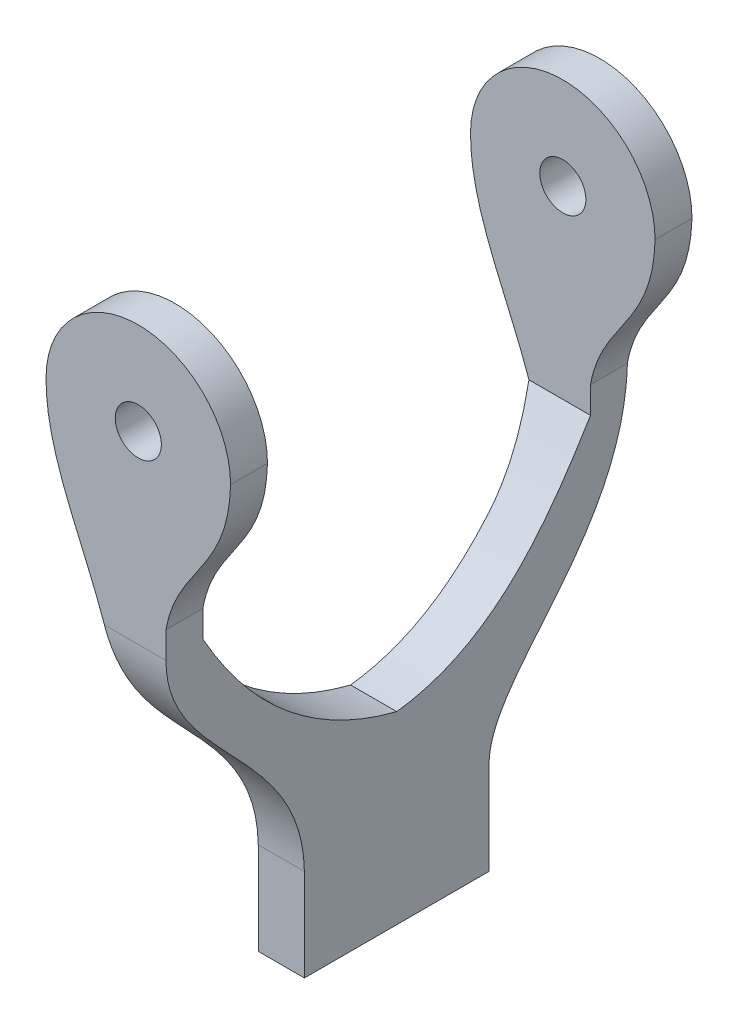
ISO-10303-21;
HEADER;
FILE_DESCRIPTION(('STEP AP214'),'2;1');
FILE_NAME('part.step','',(''),(''),'','','');
FILE_SCHEMA(('AUTOMOTIVE_DESIGN { 1 0 10303 214 1 1 1 1 }'));
ENDSEC;
DATA;
#1=APPLICATION_CONTEXT('core data for automotive mechanical design processes');
#2=APPLICATION_PROTOCOL_DEFINITION('international standard','automotive_design',2000,#1);
#3=PRODUCT_CONTEXT('',#1,'mechanical');
#4=PRODUCT('Part','Part','',(#3));
#5=PRODUCT_RELATED_PRODUCT_CATEGORY('part','',(#4));
#6=PRODUCT_DEFINITION_FORMATION('','',#4);
#7=PRODUCT_DEFINITION_CONTEXT('part definition',#1,'design');
#8=PRODUCT_DEFINITION('design','',#6,#7);
#9=PRODUCT_DEFINITION_SHAPE('','',#8);
#10=(LENGTH_UNIT() NAMED_UNIT(*) SI_UNIT(.MILLI.,.METRE.));
#11=(NAMED_UNIT(*) PLANE_ANGLE_UNIT() SI_UNIT($,.RADIAN.));
#12=(NAMED_UNIT(*) SI_UNIT($,.STERADIAN.) SOLID_ANGLE_UNIT());
#13=UNCERTAINTY_MEASURE_WITH_UNIT(LENGTH_MEASURE(1.E-05),#10,'distance_accuracy_value','');
#14=(GEOMETRIC_REPRESENTATION_CONTEXT(3) GLOBAL_UNCERTAINTY_ASSIGNED_CONTEXT((#13)) GLOBAL_UNIT_ASSIGNED_CONTEXT((#10,
#11,#12)) REPRESENTATION_CONTEXT('',''));
#15=CARTESIAN_POINT('',(0.,0.,0.));
#16=DIRECTION('',(0.,0.,1.));
#17=DIRECTION('',(1.,0.,0.));
#18=AXIS2_PLACEMENT_3D('',#15,#16,#17);
#19=CARTESIAN_POINT('',(3.,0.,50.));
#20=DIRECTION('',(1.,0.,0.));
#21=DIRECTION('',(0.,0.,-1.));
#22=AXIS2_PLACEMENT_3D('',#19,#20,#21);
#23=PLANE('',#22);
#24=CARTESIAN_POINT('',(3.,-47.3,35.));
#25=CARTESIAN_POINT('',(3.,-34.6195089742628,35.2327439155144));
#26=CARTESIAN_POINT('',(3.,-30.3831516594517,49.9872871394027));
#27=CARTESIAN_POINT('',(3.,-20.,50.));
#28=B_SPLINE_CURVE_WITH_KNOTS('',3,(#24,#25,#26,#27),.UNSPECIFIED.,.F.,.F.,(4,4),(0.,1.),.UNSPECIFIED.);
#29=CARTESIAN_POINT('',(3.,-47.3,35.));
#30=VERTEX_POINT('',#29);
#31=CARTESIAN_POINT('',(3.,-20.,50.));
#32=VERTEX_POINT('',#31);
#33=EDGE_CURVE('E225',#30,#32,#28,.T.);
#34=ORIENTED_EDGE('',*,*,#33,.F.);
#35=DIRECTION('',(0.,1.,0.));
#36=VECTOR('',#35,1.);
#37=CARTESIAN_POINT('',(3.,0.,35.));
#38=LINE('',#37,#36);
#39=CARTESIAN_POINT('',(3.,-57.3,35.));
#40=VERTEX_POINT('',#39);
#41=EDGE_CURVE('E467',#40,#30,#38,.T.);
#42=ORIENTED_EDGE('',*,*,#41,.F.);
#43=DIRECTION('',(0.,0.,-1.));
#44=VECTOR('',#43,1.);
#45=CARTESIAN_POINT('',(3.,-57.3,50.));
#46=LINE('',#45,#44);
#47=CARTESIAN_POINT('',(3.,-57.3,15.));
#48=VERTEX_POINT('',#47);
#49=EDGE_CURVE('E747',#40,#48,#46,.T.);
#50=ORIENTED_EDGE('',*,*,#49,.T.);
#51=DIRECTION('',(0.,1.,0.));
#52=VECTOR('',#51,1.);
#53=CARTESIAN_POINT('',(3.,0.,15.));
#54=LINE('',#53,#52);
#55=CARTESIAN_POINT('',(3.,-47.3,15.));
#56=VERTEX_POINT('',#55);
#57=EDGE_CURVE('E330',#48,#56,#54,.T.);
#58=ORIENTED_EDGE('',*,*,#57,.T.);
#59=CARTESIAN_POINT('',(3.,-47.3,15.));
#60=CARTESIAN_POINT('',(3.,-39.1518738556845,14.9787719706216));
#61=CARTESIAN_POINT('',(3.,-32.7020693906786,0.432832626758433));
#62=CARTESIAN_POINT('',(3.,-17.1256964213214,0.));
#63=B_SPLINE_CURVE_WITH_KNOTS('',3,(#59,#60,#61,#62),.UNSPECIFIED.,.F.,.F.,(4,4),(0.,1.),.UNSPECIFIED.);
#64=CARTESIAN_POINT('',(3.,-17.1256964213214,0.));
#65=VERTEX_POINT('',#64);
#66=EDGE_CURVE('E338',#56,#65,#63,.T.);
#67=ORIENTED_EDGE('',*,*,#66,.T.);
#68=DIRECTION('',(0.,0.,-1.));
#69=VECTOR('',#68,1.);
#70=CARTESIAN_POINT('',(3.,-17.1256964213214,50.));
#71=LINE('',#70,#69);
#72=CARTESIAN_POINT('',(3.,-17.1256964213214,4.00000000000002));
#73=VERTEX_POINT('',#72);
#74=EDGE_CURVE('E528',#73,#65,#71,.T.);
#75=ORIENTED_EDGE('',*,*,#74,.F.);
#76=DIRECTION('',(0.,1.,0.));
#77=VECTOR('',#76,1.);
#78=CARTESIAN_POINT('',(3.,0.,4.00000000000002));
#79=LINE('',#78,#77);
#80=CARTESIAN_POINT('',(3.,-20.,4.00000000000002));
#81=VERTEX_POINT('',#80);
#82=EDGE_CURVE('E438',#81,#73,#79,.T.);
#83=ORIENTED_EDGE('',*,*,#82,.F.);
#84=CARTESIAN_POINT('',(3.,-20.,4.00000000000002));
#85=CARTESIAN_POINT('',(3.,-27.7513887530113,8.70854721162843));
#86=CARTESIAN_POINT('',(3.,-36.0463975967775,14.5376235676267));
#87=CARTESIAN_POINT('',(3.,-37.3,25.));
#88=B_SPLINE_CURVE_WITH_KNOTS('',3,(#84,#85,#86,#87),.UNSPECIFIED.,.F.,.F.,(4,4),(0.,1.),.UNSPECIFIED.);
#89=CARTESIAN_POINT('',(3.,-37.3,25.));
#90=VERTEX_POINT('',#89);
#91=EDGE_CURVE('E488',#81,#90,#88,.T.);
#92=ORIENTED_EDGE('',*,*,#91,.T.);
#93=CARTESIAN_POINT('',(3.,-20.,46.));
#94=CARTESIAN_POINT('',(3.,-29.3151360524413,40.7756498759149));
#95=CARTESIAN_POINT('',(3.,-35.0937326612851,33.7969783945719));
#96=CARTESIAN_POINT('',(3.,-37.3,25.));
#97=B_SPLINE_CURVE_WITH_KNOTS('',3,(#93,#94,#95,#96),.UNSPECIFIED.,.F.,.F.,(4,4),(0.,1.),.UNSPECIFIED.);
#98=CARTESIAN_POINT('',(3.,-20.,46.));
#99=VERTEX_POINT('',#98);
#100=EDGE_CURVE('E475',#99,#90,#97,.T.);
#101=ORIENTED_EDGE('',*,*,#100,.F.);
#102=DIRECTION('',(0.,1.,0.));
#103=VECTOR('',#102,1.);
#104=CARTESIAN_POINT('',(3.,0.,46.));
#105=LINE('',#104,#103);
#106=CARTESIAN_POINT('',(3.,-17.1256964213214,46.));
#107=VERTEX_POINT('',#106);
#108=EDGE_CURVE('E331',#99,#107,#105,.T.);
#109=ORIENTED_EDGE('',*,*,#108,.T.);
#110=CARTESIAN_POINT('',(3.,-17.1256964213214,50.));
#111=VERTEX_POINT('',#110);
#112=EDGE_CURVE('E532',#111,#107,#71,.T.);
#113=ORIENTED_EDGE('',*,*,#112,.F.);
#114=DIRECTION('',(0.,-1.,0.));
#115=VECTOR('',#114,1.);
#116=CARTESIAN_POINT('',(3.,0.,50.));
#117=LINE('',#116,#115);
#118=EDGE_CURVE('E576',#111,#32,#117,.T.);
#119=ORIENTED_EDGE('',*,*,#118,.T.);
#120=EDGE_LOOP('',(#34,#42,#50,#58,#67,#75,#83,#92,#101,#109,#113,#119));
#121=FACE_BOUND('',#120,.T.);
#122=ADVANCED_FACE('F202',(#121),#23,.T.);
#123=CARTESIAN_POINT('',(10.,0.,50.));
#124=CARTESIAN_POINT('',(9.76053706222571,-8.68136411070866,50.));
#125=CARTESIAN_POINT('',(4.19700701561525,-10.3098091101832,50.));
#126=CARTESIAN_POINT('',(3.,-17.1256964213214,50.));
#127=B_SPLINE_CURVE_WITH_KNOTS('',3,(#123,#124,#125,#126),.UNSPECIFIED.,.F.,.F.,(4,4),(0.,1.),.UNSPECIFIED.);
#128=DIRECTION('',(0.,0.,-1.));
#129=VECTOR('',#128,1.);
#130=SURFACE_OF_LINEAR_EXTRUSION('',#127,#129);
#131=ORIENTED_EDGE('',*,*,#112,.T.);
#132=CARTESIAN_POINT('',(10.,0.,46.));
#133=CARTESIAN_POINT('',(9.76053706222571,-8.68136411070866,46.));
#134=CARTESIAN_POINT('',(4.19700701561525,-10.3098091101832,46.));
#135=CARTESIAN_POINT('',(3.,-17.1256964213214,46.));
#136=B_SPLINE_CURVE_WITH_KNOTS('',3,(#132,#133,#134,#135),.UNSPECIFIED.,.F.,.F.,(4,4),(0.,1.),.UNSPECIFIED.);
#137=CARTESIAN_POINT('',(10.,0.,46.));
#138=VERTEX_POINT('',#137);
#139=EDGE_CURVE('E454',#107,#138,#136,.F.);
#140=ORIENTED_EDGE('',*,*,#139,.T.);
#141=DIRECTION('',(0.,0.,-1.));
#142=VECTOR('',#141,1.);
#143=CARTESIAN_POINT('',(10.,0.,50.));
#144=LINE('',#143,#142);
#145=CARTESIAN_POINT('',(10.,0.,50.));
#146=VERTEX_POINT('',#145);
#147=EDGE_CURVE('E533',#146,#138,#144,.T.);
#148=ORIENTED_EDGE('',*,*,#147,.F.);
#149=EDGE_CURVE('E572',#146,#111,#127,.T.);
#150=ORIENTED_EDGE('',*,*,#149,.T.);
#151=EDGE_LOOP('',(#131,#140,#148,#150));
#152=FACE_BOUND('',#151,.T.);
#153=ADVANCED_FACE('F570',(#152),#130,.T.);
#154=CARTESIAN_POINT('',(0.,0.,50.));
#155=DIRECTION('',(0.,0.,-1.));
#156=DIRECTION('',(-1.,0.,0.));
#157=AXIS2_PLACEMENT_3D('',#154,#155,#156);
#158=CYLINDRICAL_SURFACE('',#157,10.);
#159=CARTESIAN_POINT('',(0.,0.,46.));
#160=DIRECTION('',(0.,0.,-1.));
#161=DIRECTION('',(-1.,0.,0.));
#162=AXIS2_PLACEMENT_3D('',#159,#160,#161);
#163=CIRCLE('',#162,10.);
#164=CARTESIAN_POINT('',(-10.,0.,46.));
#165=VERTEX_POINT('',#164);
#166=EDGE_CURVE('E449',#165,#138,#163,.T.);
#167=ORIENTED_EDGE('',*,*,#166,.F.);
#168=DIRECTION('',(0.,0.,-1.));
#169=VECTOR('',#168,1.);
#170=CARTESIAN_POINT('',(-10.,0.,50.));
#171=LINE('',#170,#169);
#172=CARTESIAN_POINT('',(-10.,0.,50.));
#173=VERTEX_POINT('',#172);
#174=EDGE_CURVE('E563',#173,#165,#171,.T.);
#175=ORIENTED_EDGE('',*,*,#174,.F.);
#176=CARTESIAN_POINT('',(0.,0.,50.));
#177=DIRECTION('',(0.,0.,1.));
#178=DIRECTION('',(1.,0.,0.));
#179=AXIS2_PLACEMENT_3D('',#176,#177,#178);
#180=CIRCLE('',#179,10.);
#181=EDGE_CURVE('E575',#146,#173,#180,.T.);
#182=ORIENTED_EDGE('',*,*,#181,.F.);
#183=ORIENTED_EDGE('',*,*,#147,.T.);
#184=EDGE_LOOP('',(#167,#175,#182,#183));
#185=FACE_BOUND('',#184,.T.);
#186=ADVANCED_FACE('F593',(#185),#158,.T.);
#187=CARTESIAN_POINT('',(-10.,0.,50.));
#188=CARTESIAN_POINT('',(-10.0381025429552,-9.9152488273029,50.));
#189=CARTESIAN_POINT('',(-2.13214803939277,-18.0107089346552,50.));
#190=CARTESIAN_POINT('',(-2.,-28.65,50.));
#191=B_SPLINE_CURVE_WITH_KNOTS('',3,(#187,#188,#189,#190),.UNSPECIFIED.,.F.,.F.,(4,4),(0.,1.),.UNSPECIFIED.);
#192=DIRECTION('',(0.,0.,-1.));
#193=VECTOR('',#192,1.);
#194=SURFACE_OF_LINEAR_EXTRUSION('',#191,#193);
#195=CARTESIAN_POINT('',(-2.,-28.65,3.24522796726486));
#196=CARTESIAN_POINT('',(-2.00319050221691,-28.3918035784122,3.10181861466091));
#197=CARTESIAN_POINT('',(-2.0110357024876,-28.1315540666096,2.96216444686479));
#198=CARTESIAN_POINT('',(-2.03622458556083,-27.6072590318931,2.69099481375502));
#199=CARTESIAN_POINT('',(-2.05356959796605,-27.3432129826509,2.55948049057015));
#200=CARTESIAN_POINT('',(-2.09794552033224,-26.8117181077601,2.30526445536006));
#201=CARTESIAN_POINT('',(-2.12497604473298,-26.5442694179724,2.18256239277031));
#202=CARTESIAN_POINT('',(-2.18876805357431,-26.0064284652427,1.94652555654433));
#203=CARTESIAN_POINT('',(-2.2255290304579,-25.7360363565397,1.8331902947243));
#204=CARTESIAN_POINT('',(-2.30763755000294,-25.1997660198973,1.61911727294138));
#205=CARTESIAN_POINT('',(-2.35274109471458,-24.9339495211835,1.51813123379908));
#206=CARTESIAN_POINT('',(-2.45190106280641,-24.4005438751176,1.32581601529002));
#207=CARTESIAN_POINT('',(-2.50595620988256,-24.1329549856837,1.23448546229778));
#208=CARTESIAN_POINT('',(-2.62268483906275,-23.5965290603403,1.06168893292526));
#209=CARTESIAN_POINT('',(-2.68535689434335,-23.327692238175,0.980221327588259));
#210=CARTESIAN_POINT('',(-2.81885903251058,-22.7893020249097,0.827252348026532));
#211=CARTESIAN_POINT('',(-2.88968682469996,-22.5197488556886,0.755748187784257));
#212=CARTESIAN_POINT('',(-3.04259631065746,-21.9671809993579,0.619433337165946));
#213=CARTESIAN_POINT('',(-3.12505789783672,-21.6841494756087,0.555117609107765));
#214=CARTESIAN_POINT('',(-3.29762694257031,-21.118172132811,0.437288751416228));
#215=CARTESIAN_POINT('',(-3.3877345630193,-20.8352263157174,0.38377585201346));
#216=CARTESIAN_POINT('',(-3.5747992317091,-20.269735141511,0.287332175405288));
#217=CARTESIAN_POINT('',(-3.67175777752292,-19.9871898858135,0.244403721163421));
#218=CARTESIAN_POINT('',(-3.87374435113785,-19.416890110047,0.168067840884002));
#219=CARTESIAN_POINT('',(-3.97889939213684,-19.1291513215938,0.134880175978607));
#220=CARTESIAN_POINT('',(-4.19444071270027,-18.5547136859973,0.0789217274812884));
#221=CARTESIAN_POINT('',(-4.30482575893047,-18.2680146106691,0.0561485013281013));
#222=CARTESIAN_POINT('',(-4.52977686426043,-17.6959203249283,0.0206490904042412));
#223=CARTESIAN_POINT('',(-4.6443392102313,-17.4105241986115,0.0079142000302709));
#224=CARTESIAN_POINT('',(-4.76055078593592,-17.1256964213214,0.));
#225=B_SPLINE_CURVE_WITH_KNOTS('',3,(#195,#196,#197,#198,#199,#200,#201,#202,#203,#204,#205,
#206,#207,#208,#209,#210,#211,#212,#213,#214,#215,#216,#217,#218,#219,#220,#221,#222,#223,#224),
.UNSPECIFIED.,.F.,.F.,(4,2,2,2,2,2,2,2,2,2,2,2,2,2,4),(0.,0.886066767381674,1.77225758120832,
2.65841312152641,3.54452244756588,4.40793974092059,5.27123403554818,6.13438555409037,
6.99729522838533,7.9021909800306,8.80710601483749,9.71221947452267,10.6364112796944,
11.5603862172707,12.4835589664749),.UNSPECIFIED.);
#226=CARTESIAN_POINT('',(-2.,-28.6499999902453,3.24522796184754));
#227=VERTEX_POINT('',#226);
#228=CARTESIAN_POINT('',(-4.7605507861737,-17.1256964207386,0.));
#229=VERTEX_POINT('',#228);
#230=EDGE_CURVE('E347',#227,#229,#225,.T.);
#231=ORIENTED_EDGE('',*,*,#230,.F.);
#232=DIRECTION('',(0.,0.,-1.));
#233=VECTOR('',#232,1.);
#234=CARTESIAN_POINT('',(-2.,-28.65,50.));
#235=LINE('',#234,#233);
#236=CARTESIAN_POINT('',(-2.,-28.6500000005184,10.0408694635859));
#237=VERTEX_POINT('',#236);
#238=EDGE_CURVE('E346',#237,#227,#235,.T.);
#239=ORIENTED_EDGE('',*,*,#238,.F.);
#240=CARTESIAN_POINT('',(-3.66836925329302,-20.,4.00000000000002));
#241=CARTESIAN_POINT('',(-3.58325952012987,-20.2457187671724,4.14926177942749));
#242=CARTESIAN_POINT('',(-3.50053248037769,-20.4917004050733,4.29947564828459));
#243=CARTESIAN_POINT('',(-3.34062207075634,-20.983216351856,4.60172206923875));
#244=CARTESIAN_POINT('',(-3.26342234161704,-21.2287496902266,4.7537475568553));
#245=CARTESIAN_POINT('',(-3.11501685187096,-21.7192409870309,5.0600272179929));
#246=CARTESIAN_POINT('',(-3.04379513144173,-21.9641986625015,5.21427407976655));
#247=CARTESIAN_POINT('',(-2.90773588417486,-22.4533866661485,5.52539777441254));
#248=CARTESIAN_POINT('',(-2.84288404390861,-22.6976173709655,5.68226773877573));
#249=CARTESIAN_POINT('',(-2.71990374133921,-23.1851873762409,5.99904081903819));
#250=CARTESIAN_POINT('',(-2.66176393530821,-23.4285274871522,6.15893826956205));
#251=CARTESIAN_POINT('',(-2.55249037159493,-23.9141335561717,6.48217290342177));
#252=CARTESIAN_POINT('',(-2.50134960634212,-24.156400350162,6.64550645455734));
#253=CARTESIAN_POINT('',(-2.40623749109161,-24.6399689209758,6.97624046717939));
#254=CARTESIAN_POINT('',(-2.36227411324641,-24.8812693382154,7.14364521680807));
#255=CARTESIAN_POINT('',(-2.28177323068728,-25.3622936409798,7.4826948736232));
#256=CARTESIAN_POINT('',(-2.24523907890267,-25.6020167676293,7.65434165628689));
#257=CARTESIAN_POINT('',(-2.17969878911859,-26.0795906808111,8.00227762483459));
#258=CARTESIAN_POINT('',(-2.15070233715697,-26.3174386811419,8.17857246643165));
#259=CARTESIAN_POINT('',(-2.10026636623018,-26.7909463085338,8.53622341760222));
#260=CARTESIAN_POINT('',(-2.07884368210517,-27.0265999408216,8.71758984729966));
#261=CARTESIAN_POINT('',(-2.0435192610474,-27.4953815031883,9.0858241552931));
#262=CARTESIAN_POINT('',(-2.02964201470679,-27.7284988302088,9.27270789663451));
#263=CARTESIAN_POINT('',(-2.00927285348669,-28.1918418614888,9.65243704940226));
#264=CARTESIAN_POINT('',(-2.00281309079348,-28.4220507308788,9.84530472092453));
#265=CARTESIAN_POINT('',(-2.,-28.65,10.0408694631412));
#266=B_SPLINE_CURVE_WITH_KNOTS('',3,(#240,#241,#242,#243,#244,#245,#246,#247,#248,#249,#250,
#251,#252,#253,#254,#255,#256,#257,#258,#259,#260,#261,#262,#263,#264,#265),.UNSPECIFIED.,.F.,
.F.,(4,2,2,2,2,2,2,2,2,2,2,2,4),(0.,0.899510558674917,1.79623819473745,2.69049013036843,
3.58268431998395,4.47334786427279,5.36311303174749,6.25385986301706,7.1450078147876,
8.0372953044067,8.9315538665807,9.82869789871525,10.729716226968),.UNSPECIFIED.);
#267=CARTESIAN_POINT('',(-3.66836925362566,-20.,4.00000000000002));
#268=VERTEX_POINT('',#267);
#269=EDGE_CURVE('E479',#268,#237,#266,.T.);
#270=ORIENTED_EDGE('',*,*,#269,.F.);
#271=CARTESIAN_POINT('',(-10.,0.,4.00000000000002));
#272=CARTESIAN_POINT('',(-10.0381025429552,-9.9152488273029,4.00000000000002));
#273=CARTESIAN_POINT('',(-2.13214803939277,-18.0107089346552,4.00000000000002));
#274=CARTESIAN_POINT('',(-2.,-28.65,4.00000000000002));
#275=B_SPLINE_CURVE_WITH_KNOTS('',3,(#271,#272,#273,#274),.UNSPECIFIED.,.F.,.F.,(4,4),(0.,1.),.UNSPECIFIED.);
#276=CARTESIAN_POINT('',(-10.,0.,4.00000000000002));
#277=VERTEX_POINT('',#276);
#278=EDGE_CURVE('E420',#268,#277,#275,.F.);
#279=ORIENTED_EDGE('',*,*,#278,.T.);
#280=CARTESIAN_POINT('',(-10.,0.,0.));
#281=VERTEX_POINT('',#280);
#282=EDGE_CURVE('E779',#277,#281,#171,.T.);
#283=ORIENTED_EDGE('',*,*,#282,.T.);
#284=CARTESIAN_POINT('',(-10.,0.,0.));
#285=CARTESIAN_POINT('',(-10.0381025429552,-9.9152488273029,0.));
#286=CARTESIAN_POINT('',(-2.13214803939277,-18.0107089346552,0.));
#287=CARTESIAN_POINT('',(-2.,-28.65,0.));
#288=B_SPLINE_CURVE_WITH_KNOTS('',3,(#284,#285,#286,#287),.UNSPECIFIED.,.F.,.F.,(4,4),(0.,1.),.UNSPECIFIED.);
#289=EDGE_CURVE('E766',#281,#229,#288,.T.);
#290=ORIENTED_EDGE('',*,*,#289,.T.);
#291=EDGE_LOOP('',(#231,#239,#270,#279,#283,#290));
#292=FACE_BOUND('',#291,.T.);
#293=ADVANCED_FACE('F598',(#292),#194,.F.);
#294=CARTESIAN_POINT('',(-2.,0.,50.));
#295=DIRECTION('',(1.,0.,0.));
#296=DIRECTION('',(0.,0.,-1.));
#297=AXIS2_PLACEMENT_3D('',#294,#295,#296);
#298=PLANE('',#297);
#299=DIRECTION('',(0.,1.,0.));
#300=VECTOR('',#299,1.);
#301=CARTESIAN_POINT('',(-2.,0.,35.));
#302=LINE('',#301,#300);
#303=CARTESIAN_POINT('',(-2.,-57.3,35.));
#304=VERTEX_POINT('',#303);
#305=CARTESIAN_POINT('',(-2.,-47.3,35.));
#306=VERTEX_POINT('',#305);
#307=EDGE_CURVE('E465',#304,#306,#302,.T.);
#308=ORIENTED_EDGE('',*,*,#307,.T.);
#309=CARTESIAN_POINT('',(-2.,-47.3,35.));
#310=CARTESIAN_POINT('',(-2.,-34.6195089742628,35.2327439155144));
#311=CARTESIAN_POINT('',(-2.,-30.3831516594517,49.9872871394027));
#312=CARTESIAN_POINT('',(-2.,-20.,50.));
#313=B_SPLINE_CURVE_WITH_KNOTS('',3,(#309,#310,#311,#312),.UNSPECIFIED.,.F.,.F.,(4,4),(0.,1.),.UNSPECIFIED.);
#314=CARTESIAN_POINT('',(-2.,-28.6500000000008,46.3427193832673));
#315=VERTEX_POINT('',#314);
#316=EDGE_CURVE('E413',#306,#315,#313,.T.);
#317=ORIENTED_EDGE('',*,*,#316,.T.);
#318=CARTESIAN_POINT('',(-2.,-28.6499999902558,39.7049280451041));
#319=VERTEX_POINT('',#318);
#320=EDGE_CURVE('E557',#315,#319,#235,.T.);
#321=ORIENTED_EDGE('',*,*,#320,.T.);
#322=CARTESIAN_POINT('',(-2.,-20.,46.));
#323=CARTESIAN_POINT('',(-2.,-29.3151360524413,40.7756498759149));
#324=CARTESIAN_POINT('',(-2.,-35.0937326612851,33.7969783945719));
#325=CARTESIAN_POINT('',(-2.,-37.3,25.));
#326=B_SPLINE_CURVE_WITH_KNOTS('',3,(#322,#323,#324,#325),.UNSPECIFIED.,.F.,.F.,(4,4),(0.,1.),.UNSPECIFIED.);
#327=CARTESIAN_POINT('',(-2.,-37.3,25.));
#328=VERTEX_POINT('',#327);
#329=EDGE_CURVE('E211',#319,#328,#326,.T.);
#330=ORIENTED_EDGE('',*,*,#329,.T.);
#331=CARTESIAN_POINT('',(-2.,-20.,4.00000000000002));
#332=CARTESIAN_POINT('',(-2.,-27.7513887530113,8.70854721162843));
#333=CARTESIAN_POINT('',(-2.,-36.0463975967775,14.5376235676267));
#334=CARTESIAN_POINT('',(-2.,-37.3,25.));
#335=B_SPLINE_CURVE_WITH_KNOTS('',3,(#331,#332,#333,#334),.UNSPECIFIED.,.F.,.F.,(4,4),(0.,1.),.UNSPECIFIED.);
#336=EDGE_CURVE('E12',#237,#328,#335,.T.);
#337=ORIENTED_EDGE('',*,*,#336,.F.);
#338=ORIENTED_EDGE('',*,*,#238,.T.);
#339=CARTESIAN_POINT('',(-2.,-47.3,15.));
#340=CARTESIAN_POINT('',(-2.,-39.1518738556845,14.9787719706216));
#341=CARTESIAN_POINT('',(-2.,-32.7020693906786,0.432832626758433));
#342=CARTESIAN_POINT('',(-2.,-17.1256964213214,0.));
#343=B_SPLINE_CURVE_WITH_KNOTS('',3,(#339,#340,#341,#342),.UNSPECIFIED.,.F.,.F.,(4,4),(0.,1.),.UNSPECIFIED.);
#344=CARTESIAN_POINT('',(-2.,-47.3,15.));
#345=VERTEX_POINT('',#344);
#346=EDGE_CURVE('E335',#345,#227,#343,.T.);
#347=ORIENTED_EDGE('',*,*,#346,.F.);
#348=DIRECTION('',(0.,1.,0.));
#349=VECTOR('',#348,1.);
#350=CARTESIAN_POINT('',(-2.,0.,15.));
#351=LINE('',#350,#349);
#352=CARTESIAN_POINT('',(-2.,-57.3,15.));
#353=VERTEX_POINT('',#352);
#354=EDGE_CURVE('E319',#353,#345,#351,.T.);
#355=ORIENTED_EDGE('',*,*,#354,.F.);
#356=DIRECTION('',(0.,0.,-1.));
#357=VECTOR('',#356,1.);
#358=CARTESIAN_POINT('',(-2.,-57.3,50.));
#359=LINE('',#358,#357);
#360=EDGE_CURVE('E777',#304,#353,#359,.T.);
#361=ORIENTED_EDGE('',*,*,#360,.F.);
#362=EDGE_LOOP('',(#308,#317,#321,#330,#337,#338,#347,#355,#361));
#363=FACE_BOUND('',#362,.T.);
#364=ADVANCED_FACE('F343',(#363),#298,.F.);
#365=CARTESIAN_POINT('',(0.,-57.3,50.));
#366=DIRECTION('',(0.,-1.,0.));
#367=DIRECTION('',(0.,0.,-1.));
#368=AXIS2_PLACEMENT_3D('',#365,#366,#367);
#369=PLANE('',#368);
#370=DIRECTION('',(1.,0.,0.));
#371=VECTOR('',#370,1.);
#372=CARTESIAN_POINT('',(-10.0190512714776,-57.3,35.));
#373=LINE('',#372,#371);
#374=EDGE_CURVE('E504',#304,#40,#373,.T.);
#375=ORIENTED_EDGE('',*,*,#374,.F.);
#376=ORIENTED_EDGE('',*,*,#360,.T.);
#377=DIRECTION('',(1.,0.,0.));
#378=VECTOR('',#377,1.);
#379=CARTESIAN_POINT('',(-10.0190512714776,-57.3,15.));
#380=LINE('',#379,#378);
#381=EDGE_CURVE('E325',#353,#48,#380,.T.);
#382=ORIENTED_EDGE('',*,*,#381,.T.);
#383=ORIENTED_EDGE('',*,*,#49,.F.);
#384=EDGE_LOOP('',(#375,#376,#382,#383));
#385=FACE_BOUND('',#384,.T.);
#386=ADVANCED_FACE('F623',(#385),#369,.T.);
#387=CARTESIAN_POINT('',(0.,0.,50.));
#388=DIRECTION('',(0.,0.,-1.));
#389=DIRECTION('',(-1.,0.,0.));
#390=AXIS2_PLACEMENT_3D('',#387,#388,#389);
#391=CYLINDRICAL_SURFACE('',#390,2.5);
#392=CARTESIAN_POINT('',(0.,0.,50.));
#393=DIRECTION('',(0.,0.,1.));
#394=DIRECTION('',(1.,0.,0.));
#395=AXIS2_PLACEMENT_3D('',#392,#393,#394);
#396=CIRCLE('',#395,2.5);
#397=CARTESIAN_POINT('',(2.5,0.,50.));
#398=VERTEX_POINT('',#397);
#399=EDGE_CURVE('E745',#398,#398,#396,.T.);
#400=ORIENTED_EDGE('',*,*,#399,.T.);
#401=EDGE_LOOP('',(#400));
#402=FACE_BOUND('',#401,.T.);
#403=CARTESIAN_POINT('',(0.,0.,46.));
#404=DIRECTION('',(0.,0.,-1.));
#405=DIRECTION('',(-1.,0.,0.));
#406=AXIS2_PLACEMENT_3D('',#403,#404,#405);
#407=CIRCLE('',#406,2.5);
#408=CARTESIAN_POINT('',(-2.5,0.,46.));
#409=VERTEX_POINT('',#408);
#410=EDGE_CURVE('E443',#409,#409,#407,.T.);
#411=ORIENTED_EDGE('',*,*,#410,.T.);
#412=EDGE_LOOP('',(#411));
#413=FACE_BOUND('',#412,.T.);
#414=ADVANCED_FACE('F629',(#402,#413),#391,.F.);
#415=CARTESIAN_POINT('',(0.,0.,0.));
#416=DIRECTION('',(0.,0.,1.));
#417=DIRECTION('',(1.,0.,0.));
#418=AXIS2_PLACEMENT_3D('',#415,#416,#417);
#419=PLANE('',#418);
#420=CARTESIAN_POINT('',(0.,0.,0.));
#421=DIRECTION('',(0.,0.,1.));
#422=DIRECTION('',(1.,0.,0.));
#423=AXIS2_PLACEMENT_3D('',#420,#421,#422);
#424=CIRCLE('',#423,2.5);
#425=CARTESIAN_POINT('',(2.5,0.,0.));
#426=VERTEX_POINT('',#425);
#427=EDGE_CURVE('E580',#426,#426,#424,.T.);
#428=ORIENTED_EDGE('',*,*,#427,.T.);
#429=EDGE_LOOP('',(#428));
#430=FACE_BOUND('',#429,.T.);
#431=DIRECTION('',(1.,0.,0.));
#432=VECTOR('',#431,1.);
#433=CARTESIAN_POINT('',(-10.0190512714776,-17.1256964213214,0.));
#434=LINE('',#433,#432);
#435=EDGE_CURVE('E536',#229,#65,#434,.T.);
#436=ORIENTED_EDGE('',*,*,#435,.F.);
#437=ORIENTED_EDGE('',*,*,#289,.F.);
#438=CARTESIAN_POINT('',(0.,0.,0.));
#439=DIRECTION('',(0.,0.,1.));
#440=DIRECTION('',(1.,0.,0.));
#441=AXIS2_PLACEMENT_3D('',#438,#439,#440);
#442=CIRCLE('',#441,10.);
#443=CARTESIAN_POINT('',(10.,0.,0.));
#444=VERTEX_POINT('',#443);
#445=EDGE_CURVE('E760',#444,#281,#442,.T.);
#446=ORIENTED_EDGE('',*,*,#445,.F.);
#447=CARTESIAN_POINT('',(10.,0.,0.));
#448=CARTESIAN_POINT('',(9.76053706222571,-8.68136411070866,0.));
#449=CARTESIAN_POINT('',(4.19700701561525,-10.3098091101832,0.));
#450=CARTESIAN_POINT('',(3.,-17.1256964213214,0.));
#451=B_SPLINE_CURVE_WITH_KNOTS('',3,(#447,#448,#449,#450),.UNSPECIFIED.,.F.,.F.,(4,4),(0.,1.),.UNSPECIFIED.);
#452=EDGE_CURVE('E756',#444,#65,#451,.T.);
#453=ORIENTED_EDGE('',*,*,#452,.T.);
#454=EDGE_LOOP('',(#436,#437,#446,#453));
#455=FACE_BOUND('',#454,.T.);
#456=ADVANCED_FACE('F590',(#430,#455),#419,.F.);
#457=CARTESIAN_POINT('',(10.,0.,4.00000000000002));
#458=CARTESIAN_POINT('',(9.76053706222571,-8.68136411070866,4.00000000000002));
#459=CARTESIAN_POINT('',(4.19700701561525,-10.3098091101832,4.00000000000002));
#460=CARTESIAN_POINT('',(3.,-17.1256964213214,4.00000000000002));
#461=B_SPLINE_CURVE_WITH_KNOTS('',3,(#457,#458,#459,#460),.UNSPECIFIED.,.F.,.F.,(4,4),(0.,1.),.UNSPECIFIED.);
#462=CARTESIAN_POINT('',(10.,0.,4.00000000000002));
#463=VERTEX_POINT('',#462);
#464=EDGE_CURVE('E433',#73,#463,#461,.F.);
#465=ORIENTED_EDGE('',*,*,#464,.F.);
#466=ORIENTED_EDGE('',*,*,#74,.T.);
#467=ORIENTED_EDGE('',*,*,#452,.F.);
#468=EDGE_CURVE('E538',#463,#444,#144,.T.);
#469=ORIENTED_EDGE('',*,*,#468,.F.);
#470=EDGE_LOOP('',(#465,#466,#467,#469));
#471=FACE_BOUND('',#470,.T.);
#472=ADVANCED_FACE('F587',(#471),#130,.T.);
#473=CARTESIAN_POINT('',(0.,0.,4.00000000000002));
#474=DIRECTION('',(0.,0.,-1.));
#475=DIRECTION('',(-1.,0.,0.));
#476=AXIS2_PLACEMENT_3D('',#473,#474,#475);
#477=CIRCLE('',#476,10.);
#478=EDGE_CURVE('E428',#277,#463,#477,.T.);
#479=ORIENTED_EDGE('',*,*,#478,.T.);
#480=ORIENTED_EDGE('',*,*,#468,.T.);
#481=ORIENTED_EDGE('',*,*,#445,.T.);
#482=ORIENTED_EDGE('',*,*,#282,.F.);
#483=EDGE_LOOP('',(#479,#480,#481,#482));
#484=FACE_BOUND('',#483,.T.);
#485=ADVANCED_FACE('F589',(#484),#158,.T.);
#486=ORIENTED_EDGE('',*,*,#320,.F.);
#487=CARTESIAN_POINT('',(-2.,-28.65,46.3427193832679));
#488=CARTESIAN_POINT('',(-2.00236533589441,-28.4600499674117,46.4981762076589));
#489=CARTESIAN_POINT('',(-2.00722930192484,-28.2682920525821,46.6514496940761));
#490=CARTESIAN_POINT('',(-2.02225306190209,-27.8802782694031,46.9528859511209));
#491=CARTESIAN_POINT('',(-2.03242543674649,-27.6840127791407,47.1010356851924));
#492=CARTESIAN_POINT('',(-2.0583660004298,-27.2868493975294,47.3908410384336));
#493=CARTESIAN_POINT('',(-2.07413848777538,-27.085948058887,47.5324915744033));
#494=CARTESIAN_POINT('',(-2.1117630227677,-26.6774515688899,47.8092026054318));
#495=CARTESIAN_POINT('',(-2.13367012139138,-26.469811604888,47.9441897605968));
#496=CARTESIAN_POINT('',(-2.18379682962612,-26.0495869946527,48.2046786847607));
#497=CARTESIAN_POINT('',(-2.21201201596011,-25.8370059063109,48.3301870182773));
#498=CARTESIAN_POINT('',(-2.27503432020262,-25.4068150649889,48.5703414037776));
#499=CARTESIAN_POINT('',(-2.30983907332753,-25.1892071405001,48.6849913304186));
#500=CARTESIAN_POINT('',(-2.38018102702405,-24.7840645018254,48.8848009910705));
#501=CARTESIAN_POINT('',(-2.41472446080045,-24.5972409061351,48.9717527266225));
#502=CARTESIAN_POINT('',(-2.48868925093109,-24.2203700560313,49.1361934735995));
#503=CARTESIAN_POINT('',(-2.52811139211257,-24.0303222872062,49.2136809585366));
#504=CARTESIAN_POINT('',(-2.61181684106467,-23.6474101526628,49.3584583284379));
#505=CARTESIAN_POINT('',(-2.6561004773363,-23.4545455973728,49.4257475235509));
#506=CARTESIAN_POINT('',(-2.74918015817752,-23.0675313132848,49.549209883805));
#507=CARTESIAN_POINT('',(-2.79795127291393,-22.8733936601966,49.6054395934334));
#508=CARTESIAN_POINT('',(-2.90000719452353,-22.483430959125,49.7068095544039));
#509=CARTESIAN_POINT('',(-2.95329171530028,-22.2876060188015,49.7519505079352));
#510=CARTESIAN_POINT('',(-3.06408011174939,-21.8949629529654,49.8309147903301));
#511=CARTESIAN_POINT('',(-3.12158205313322,-21.69814532084,49.8647432684852));
#512=CARTESIAN_POINT('',(-3.21874708436437,-21.3760848593588,49.9108035394383));
#513=CARTESIAN_POINT('',(-3.25725216047257,-21.2509636449927,49.9264102293289));
#514=CARTESIAN_POINT('',(-3.33571812858239,-21.0007283932284,49.9531079380633));
#515=CARTESIAN_POINT('',(-3.37567868908796,-20.875614360616,49.9641999782276));
#516=CARTESIAN_POINT('',(-3.49775209874331,-20.4999641789411,49.9908557407953));
#517=CARTESIAN_POINT('',(-3.58191181194685,-20.2495985437733,49.9997312801721));
#518=CARTESIAN_POINT('',(-3.66836925329303,-20.,50.));
#519=B_SPLINE_CURVE_WITH_KNOTS('',3,(#487,#488,#489,#490,#491,#492,#493,#494,#495,#496,#497,
#498,#499,#500,#501,#502,#503,#504,#505,#506,#507,#508,#509,#510,#511,#512,#513,#514,#515,#516,
#517,#518),.UNSPECIFIED.,.F.,.F.,(4,2,2,2,2,2,2,2,2,2,2,2,2,2,2,4),(0.,0.736428743241335,
1.47461079844455,2.21336069307779,2.95896503252075,3.70404817947887,4.44886444514598,
5.07541858937716,5.70207365737366,6.32877109580906,6.95217596515967,7.57554134756178,
8.19862259469028,8.59405999444652,8.98940788712472,9.78161394322275),.UNSPECIFIED.);
#520=CARTESIAN_POINT('',(-3.66836925362566,-20.,50.));
#521=VERTEX_POINT('',#520);
#522=EDGE_CURVE('E407',#315,#521,#519,.T.);
#523=ORIENTED_EDGE('',*,*,#522,.T.);
#524=EDGE_CURVE('E578',#173,#521,#191,.T.);
#525=ORIENTED_EDGE('',*,*,#524,.F.);
#526=ORIENTED_EDGE('',*,*,#174,.T.);
#527=CARTESIAN_POINT('',(-10.,0.,46.));
#528=CARTESIAN_POINT('',(-10.0381025429552,-9.9152488273029,46.));
#529=CARTESIAN_POINT('',(-2.13214803939277,-18.0107089346552,46.));
#530=CARTESIAN_POINT('',(-2.,-28.65,46.));
#531=B_SPLINE_CURVE_WITH_KNOTS('',3,(#527,#528,#529,#530),.UNSPECIFIED.,.F.,.F.,(4,4),(0.,1.),.UNSPECIFIED.);
#532=CARTESIAN_POINT('',(-3.66836925362566,-20.,46.));
#533=VERTEX_POINT('',#532);
#534=EDGE_CURVE('E444',#533,#165,#531,.F.);
#535=ORIENTED_EDGE('',*,*,#534,.F.);
#536=CARTESIAN_POINT('',(-3.66836925329302,-20.,46.));
#537=CARTESIAN_POINT('',(-3.58008541337576,-20.2548719142355,45.8570542339928));
#538=CARTESIAN_POINT('',(-3.49462074635185,-20.5093079247177,45.7115587074918));
#539=CARTESIAN_POINT('',(-3.33018516479001,-21.0159141561589,45.4159675624189));
#540=CARTESIAN_POINT('',(-3.25118621555047,-21.2680894162472,45.2658961536947));
#541=CARTESIAN_POINT('',(-3.10001449869995,-21.7701403693315,44.9609412537344));
#542=CARTESIAN_POINT('',(-3.02781617914123,-22.0200212019806,44.8060789389099));
#543=CARTESIAN_POINT('',(-2.89050293756991,-22.5174138426793,44.4913293093694));
#544=CARTESIAN_POINT('',(-2.82536659332723,-22.7649306126744,44.3314592025828));
#545=CARTESIAN_POINT('',(-2.70237736649061,-23.2575089581936,44.0064732098045));
#546=CARTESIAN_POINT('',(-2.64450868121198,-23.5025747555391,43.8413697185425));
#547=CARTESIAN_POINT('',(-2.53619345767321,-23.9901434594783,43.5056897907078));
#548=CARTESIAN_POINT('',(-2.48573806544768,-24.2326490969711,43.3351201841779));
#549=CARTESIAN_POINT('',(-2.3922901313243,-24.7151691759879,42.9881301867058));
#550=CARTESIAN_POINT('',(-2.34930294478921,-24.9551817147305,42.8117057043918));
#551=CARTESIAN_POINT('',(-2.27087073452925,-25.4323154696582,42.4529333757453));
#552=CARTESIAN_POINT('',(-2.23543210732334,-25.6694340744624,42.2705806555366));
#553=CARTESIAN_POINT('',(-2.17205898472072,-26.1405868493287,41.8997255557474));
#554=CARTESIAN_POINT('',(-2.14413913191225,-26.3746141687338,41.7112119668957));
#555=CARTESIAN_POINT('',(-2.09570373651826,-26.8393782344115,41.3277994176775));
#556=CARTESIAN_POINT('',(-2.07521118318058,-27.0701026761394,41.1328826344799));
#557=CARTESIAN_POINT('',(-2.04147821192373,-27.5280397758395,40.7364161669638));
#558=CARTESIAN_POINT('',(-2.02826885223519,-27.7552334395796,40.5348419030153));
#559=CARTESIAN_POINT('',(-2.00887426420232,-28.2058788308275,40.1248056616282));
#560=CARTESIAN_POINT('',(-2.00272738583922,-28.4293036970936,39.9163123457789));
#561=CARTESIAN_POINT('',(-2.,-28.65,39.7049280357713));
#562=B_SPLINE_CURVE_WITH_KNOTS('',3,(#536,#537,#538,#539,#540,#541,#542,#543,#544,#545,#546,
#547,#548,#549,#550,#551,#552,#553,#554,#555,#556,#557,#558,#559,#560,#561),.UNSPECIFIED.,.F.,
.F.,(4,2,2,2,2,2,2,2,2,2,2,2,4),(0.,0.915795278118216,1.82738241082724,2.73539505786665,
3.64057130522281,4.54374396006889,5.44582899813322,6.34855826446886,7.25204947131876,
8.15728768067431,9.0653043587706,9.97716378490973,10.893951639836),.UNSPECIFIED.);
#563=EDGE_CURVE('E469',#533,#319,#562,.T.);
#564=ORIENTED_EDGE('',*,*,#563,.T.);
#565=EDGE_LOOP('',(#486,#523,#525,#526,#535,#564));
#566=FACE_BOUND('',#565,.T.);
#567=ADVANCED_FACE('F369',(#566),#194,.F.);
#568=CARTESIAN_POINT('',(0.,0.,4.00000000000002));
#569=DIRECTION('',(0.,0.,-1.));
#570=DIRECTION('',(-1.,0.,0.));
#571=AXIS2_PLACEMENT_3D('',#568,#569,#570);
#572=CIRCLE('',#571,2.5);
#573=CARTESIAN_POINT('',(-2.5,0.,4.00000000000002));
#574=VERTEX_POINT('',#573);
#575=EDGE_CURVE('E419',#574,#574,#572,.T.);
#576=ORIENTED_EDGE('',*,*,#575,.F.);
#577=EDGE_LOOP('',(#576));
#578=FACE_BOUND('',#577,.T.);
#579=ORIENTED_EDGE('',*,*,#427,.F.);
#580=EDGE_LOOP('',(#579));
#581=FACE_BOUND('',#580,.T.);
#582=ADVANCED_FACE('F597',(#578,#581),#391,.F.);
#583=CARTESIAN_POINT('',(0.,0.,50.));
#584=DIRECTION('',(0.,0.,1.));
#585=DIRECTION('',(1.,0.,0.));
#586=AXIS2_PLACEMENT_3D('',#583,#584,#585);
#587=PLANE('',#586);
#588=DIRECTION('',(1.,0.,0.));
#589=VECTOR('',#588,1.);
#590=CARTESIAN_POINT('',(-10.0190512714776,-20.,50.));
#591=LINE('',#590,#589);
#592=EDGE_CURVE('E543',#32,#521,#591,.F.);
#593=ORIENTED_EDGE('',*,*,#592,.F.);
#594=ORIENTED_EDGE('',*,*,#118,.F.);
#595=ORIENTED_EDGE('',*,*,#149,.F.);
#596=ORIENTED_EDGE('',*,*,#181,.T.);
#597=ORIENTED_EDGE('',*,*,#524,.T.);
#598=EDGE_LOOP('',(#593,#594,#595,#596,#597));
#599=FACE_BOUND('',#598,.T.);
#600=ORIENTED_EDGE('',*,*,#399,.F.);
#601=EDGE_LOOP('',(#600));
#602=FACE_BOUND('',#601,.T.);
#603=ADVANCED_FACE('F499',(#599,#602),#587,.T.);
#604=CARTESIAN_POINT('',(-10.0190512714776,0.,15.));
#605=DIRECTION('',(0.,0.,-1.));
#606=DIRECTION('',(-1.,0.,0.));
#607=AXIS2_PLACEMENT_3D('',#604,#605,#606);
#608=PLANE('',#607);
#609=ORIENTED_EDGE('',*,*,#381,.F.);
#610=ORIENTED_EDGE('',*,*,#354,.T.);
#611=DIRECTION('',(1.,0.,0.));
#612=VECTOR('',#611,1.);
#613=CARTESIAN_POINT('',(-10.0190512714776,-47.3,15.));
#614=LINE('',#613,#612);
#615=EDGE_CURVE('E322',#345,#56,#614,.T.);
#616=ORIENTED_EDGE('',*,*,#615,.T.);
#617=ORIENTED_EDGE('',*,*,#57,.F.);
#618=EDGE_LOOP('',(#609,#610,#616,#617));
#619=FACE_BOUND('',#618,.T.);
#620=ADVANCED_FACE('F321',(#619),#608,.T.);
#621=CARTESIAN_POINT('',(-10.0190512714776,-47.3,15.));
#622=CARTESIAN_POINT('',(-10.0190512714776,-39.1518738556845,14.9787719706216));
#623=CARTESIAN_POINT('',(-10.0190512714776,-32.7020693906786,0.432832626758433));
#624=CARTESIAN_POINT('',(-10.0190512714776,-17.1256964213214,0.));
#625=B_SPLINE_CURVE_WITH_KNOTS('',3,(#621,#622,#623,#624),.UNSPECIFIED.,.F.,.F.,(4,4),(0.,1.),.UNSPECIFIED.);
#626=DIRECTION('',(1.,0.,0.));
#627=VECTOR('',#626,1.);
#628=SURFACE_OF_LINEAR_EXTRUSION('',#625,#627);
#629=ORIENTED_EDGE('',*,*,#615,.F.);
#630=ORIENTED_EDGE('',*,*,#346,.T.);
#631=ORIENTED_EDGE('',*,*,#230,.T.);
#632=ORIENTED_EDGE('',*,*,#435,.T.);
#633=ORIENTED_EDGE('',*,*,#66,.F.);
#634=EDGE_LOOP('',(#629,#630,#631,#632,#633));
#635=FACE_BOUND('',#634,.T.);
#636=ADVANCED_FACE('F334',(#635),#628,.T.);
#637=CARTESIAN_POINT('',(-10.0190512714776,0.,35.));
#638=DIRECTION('',(0.,0.,-1.));
#639=DIRECTION('',(-1.,0.,0.));
#640=AXIS2_PLACEMENT_3D('',#637,#638,#639);
#641=PLANE('',#640);
#642=ORIENTED_EDGE('',*,*,#41,.T.);
#643=DIRECTION('',(1.,0.,0.));
#644=VECTOR('',#643,1.);
#645=CARTESIAN_POINT('',(-10.0190512714776,-47.3,35.));
#646=LINE('',#645,#644);
#647=EDGE_CURVE('E339',#306,#30,#646,.T.);
#648=ORIENTED_EDGE('',*,*,#647,.F.);
#649=ORIENTED_EDGE('',*,*,#307,.F.);
#650=ORIENTED_EDGE('',*,*,#374,.T.);
#651=EDGE_LOOP('',(#642,#648,#649,#650));
#652=FACE_BOUND('',#651,.T.);
#653=ADVANCED_FACE('F379',(#652),#641,.F.);
#654=CARTESIAN_POINT('',(-10.0190512714776,-47.3,35.));
#655=CARTESIAN_POINT('',(-10.0190512714776,-34.6195089742628,35.2327439155144));
#656=CARTESIAN_POINT('',(-10.0190512714776,-30.3831516594517,49.9872871394027));
#657=CARTESIAN_POINT('',(-10.0190512714776,-20.,50.));
#658=B_SPLINE_CURVE_WITH_KNOTS('',3,(#654,#655,#656,#657),.UNSPECIFIED.,.F.,.F.,(4,4),(0.,1.),.UNSPECIFIED.);
#659=DIRECTION('',(1.,0.,0.));
#660=VECTOR('',#659,1.);
#661=SURFACE_OF_LINEAR_EXTRUSION('',#658,#660);
#662=ORIENTED_EDGE('',*,*,#33,.T.);
#663=ORIENTED_EDGE('',*,*,#592,.T.);
#664=ORIENTED_EDGE('',*,*,#522,.F.);
#665=ORIENTED_EDGE('',*,*,#316,.F.);
#666=ORIENTED_EDGE('',*,*,#647,.T.);
#667=EDGE_LOOP('',(#662,#663,#664,#665,#666));
#668=FACE_BOUND('',#667,.T.);
#669=ADVANCED_FACE('F397',(#668),#661,.F.);
#670=CARTESIAN_POINT('',(-10.0190512714776,-20.,4.00000000000002));
#671=CARTESIAN_POINT('',(-10.0190512714776,-27.7513887530113,8.70854721162843));
#672=CARTESIAN_POINT('',(-10.0190512714776,-36.0463975967775,14.5376235676267));
#673=CARTESIAN_POINT('',(-10.0190512714776,-37.3,25.));
#674=B_SPLINE_CURVE_WITH_KNOTS('',3,(#670,#671,#672,#673),.UNSPECIFIED.,.F.,.F.,(4,4),(0.,1.),.UNSPECIFIED.);
#675=DIRECTION('',(1.,0.,0.));
#676=VECTOR('',#675,1.);
#677=SURFACE_OF_LINEAR_EXTRUSION('',#674,#676);
#678=DIRECTION('',(1.,0.,0.));
#679=VECTOR('',#678,1.);
#680=CARTESIAN_POINT('',(-10.0190512714776,-20.,4.00000000000002));
#681=LINE('',#680,#679);
#682=EDGE_CURVE('E355',#268,#81,#681,.T.);
#683=ORIENTED_EDGE('',*,*,#682,.F.);
#684=ORIENTED_EDGE('',*,*,#269,.T.);
#685=ORIENTED_EDGE('',*,*,#336,.T.);
#686=DIRECTION('',(1.,0.,0.));
#687=VECTOR('',#686,1.);
#688=CARTESIAN_POINT('',(-10.0190512714776,-37.3,25.));
#689=LINE('',#688,#687);
#690=EDGE_CURVE('E218',#328,#90,#689,.T.);
#691=ORIENTED_EDGE('',*,*,#690,.T.);
#692=ORIENTED_EDGE('',*,*,#91,.F.);
#693=EDGE_LOOP('',(#683,#684,#685,#691,#692));
#694=FACE_BOUND('',#693,.T.);
#695=ADVANCED_FACE('F401',(#694),#677,.T.);
#696=CARTESIAN_POINT('',(-10.0190512714776,-20.,46.));
#697=CARTESIAN_POINT('',(-10.0190512714776,-29.3151360524413,40.7756498759149));
#698=CARTESIAN_POINT('',(-10.0190512714776,-35.0937326612851,33.7969783945719));
#699=CARTESIAN_POINT('',(-10.0190512714776,-37.3,25.));
#700=B_SPLINE_CURVE_WITH_KNOTS('',3,(#696,#697,#698,#699),.UNSPECIFIED.,.F.,.F.,(4,4),(0.,1.),.UNSPECIFIED.);
#701=DIRECTION('',(1.,0.,0.));
#702=VECTOR('',#701,1.);
#703=SURFACE_OF_LINEAR_EXTRUSION('',#700,#702);
#704=ORIENTED_EDGE('',*,*,#100,.T.);
#705=ORIENTED_EDGE('',*,*,#690,.F.);
#706=ORIENTED_EDGE('',*,*,#329,.F.);
#707=ORIENTED_EDGE('',*,*,#563,.F.);
#708=DIRECTION('',(1.,0.,0.));
#709=VECTOR('',#708,1.);
#710=CARTESIAN_POINT('',(-10.0190512714776,-20.,46.));
#711=LINE('',#710,#709);
#712=EDGE_CURVE('E350',#533,#99,#711,.T.);
#713=ORIENTED_EDGE('',*,*,#712,.T.);
#714=EDGE_LOOP('',(#704,#705,#706,#707,#713));
#715=FACE_BOUND('',#714,.T.);
#716=ADVANCED_FACE('F402',(#715),#703,.F.);
#717=CARTESIAN_POINT('',(-10.0190512714776,0.,46.));
#718=DIRECTION('',(0.,0.,-1.));
#719=DIRECTION('',(-1.,0.,0.));
#720=AXIS2_PLACEMENT_3D('',#717,#718,#719);
#721=PLANE('',#720);
#722=ORIENTED_EDGE('',*,*,#410,.F.);
#723=EDGE_LOOP('',(#722));
#724=FACE_BOUND('',#723,.T.);
#725=ORIENTED_EDGE('',*,*,#712,.F.);
#726=ORIENTED_EDGE('',*,*,#534,.T.);
#727=ORIENTED_EDGE('',*,*,#166,.T.);
#728=ORIENTED_EDGE('',*,*,#139,.F.);
#729=ORIENTED_EDGE('',*,*,#108,.F.);
#730=EDGE_LOOP('',(#725,#726,#727,#728,#729));
#731=FACE_BOUND('',#730,.T.);
#732=ADVANCED_FACE('F565',(#724,#731),#721,.T.);
#733=CARTESIAN_POINT('',(-10.0190512714776,0.,4.00000000000002));
#734=DIRECTION('',(0.,0.,-1.));
#735=DIRECTION('',(-1.,0.,0.));
#736=AXIS2_PLACEMENT_3D('',#733,#734,#735);
#737=PLANE('',#736);
#738=ORIENTED_EDGE('',*,*,#82,.T.);
#739=ORIENTED_EDGE('',*,*,#464,.T.);
#740=ORIENTED_EDGE('',*,*,#478,.F.);
#741=ORIENTED_EDGE('',*,*,#278,.F.);
#742=ORIENTED_EDGE('',*,*,#682,.T.);
#743=EDGE_LOOP('',(#738,#739,#740,#741,#742));
#744=FACE_BOUND('',#743,.T.);
#745=ORIENTED_EDGE('',*,*,#575,.T.);
#746=EDGE_LOOP('',(#745));
#747=FACE_BOUND('',#746,.T.);
#748=ADVANCED_FACE('F498',(#744,#747),#737,.F.);
#749=CLOSED_SHELL('',(#122,#153,#186,#293,#364,#386,#414,#456,#472,#485,#567,#582,#603,#620,
#636,#653,#669,#695,#716,#732,#748));
#750=MANIFOLD_SOLID_BREP('B2',#749);
#751=ADVANCED_BREP_SHAPE_REPRESENTATION('',(#18,#750),#14);
#752=SHAPE_DEFINITION_REPRESENTATION(#9,#751);
ENDSEC;
END-ISO-10303-21;
